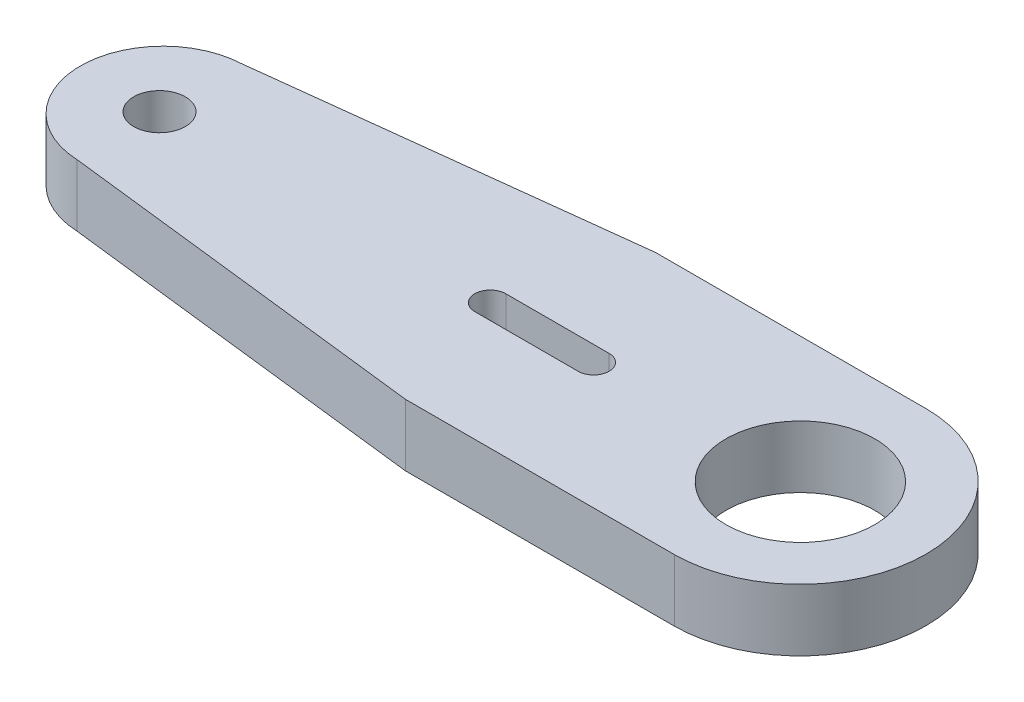
ISO-10303-21;
HEADER;
FILE_DESCRIPTION(('STEP AP214'),'2;1');
FILE_NAME('part.step','',(''),(''),'','','');
FILE_SCHEMA(('AUTOMOTIVE_DESIGN { 1 0 10303 214 1 1 1 1 }'));
ENDSEC;
DATA;
#1=APPLICATION_CONTEXT('core data for automotive mechanical design processes');
#2=APPLICATION_PROTOCOL_DEFINITION('international standard','automotive_design',2000,#1);
#3=PRODUCT_CONTEXT('',#1,'mechanical');
#4=PRODUCT('Part','Part','',(#3));
#5=PRODUCT_RELATED_PRODUCT_CATEGORY('part','',(#4));
#6=PRODUCT_DEFINITION_FORMATION('','',#4);
#7=PRODUCT_DEFINITION_CONTEXT('part definition',#1,'design');
#8=PRODUCT_DEFINITION('design','',#6,#7);
#9=PRODUCT_DEFINITION_SHAPE('','',#8);
#10=(LENGTH_UNIT() NAMED_UNIT(*) SI_UNIT(.MILLI.,.METRE.));
#11=(NAMED_UNIT(*) PLANE_ANGLE_UNIT() SI_UNIT($,.RADIAN.));
#12=(NAMED_UNIT(*) SI_UNIT($,.STERADIAN.) SOLID_ANGLE_UNIT());
#13=UNCERTAINTY_MEASURE_WITH_UNIT(LENGTH_MEASURE(1.E-05),#10,'distance_accuracy_value','');
#14=(GEOMETRIC_REPRESENTATION_CONTEXT(3) GLOBAL_UNCERTAINTY_ASSIGNED_CONTEXT((#13)) GLOBAL_UNIT_ASSIGNED_CONTEXT((#10,
#11,#12)) REPRESENTATION_CONTEXT('',''));
#15=CARTESIAN_POINT('',(0.,0.,0.));
#16=DIRECTION('',(0.,0.,1.));
#17=DIRECTION('',(1.,0.,0.));
#18=AXIS2_PLACEMENT_3D('',#15,#16,#17);
#19=CARTESIAN_POINT('',(-4.67675694278585,3.,-39.8505559009563));
#20=DIRECTION('',(0.116557468865901,0.,0.993183948949828));
#21=DIRECTION('',(0.993183948949828,0.,-0.116557468865901));
#22=AXIS2_PLACEMENT_3D('',#19,#20,#21);
#23=PLANE('',#22);
#24=DIRECTION('',(-0.993183948949828,0.,0.116557468865901));
#25=VECTOR('',#24,1.);
#26=CARTESIAN_POINT('',(-4.67675694278585,0.,-39.8505559009563));
#27=LINE('',#26,#25);
#28=CARTESIAN_POINT('',(253.819051615869,0.,-70.186947452491));
#29=VERTEX_POINT('',#28);
#30=CARTESIAN_POINT('',(235.924992032314,0.,-68.0869474524908));
#31=VERTEX_POINT('',#30);
#32=EDGE_CURVE('E169',#29,#31,#27,.T.);
#33=ORIENTED_EDGE('',*,*,#32,.T.);
#34=DIRECTION('',(0.,-1.,0.));
#35=VECTOR('',#34,1.);
#36=CARTESIAN_POINT('',(235.924992032314,3.,-68.0869474524908));
#37=LINE('',#36,#35);
#38=CARTESIAN_POINT('',(235.924992032314,3.,-68.0869474524908));
#39=VERTEX_POINT('',#38);
#40=EDGE_CURVE('E11',#39,#31,#37,.T.);
#41=ORIENTED_EDGE('',*,*,#40,.F.);
#42=DIRECTION('',(-0.993183948949828,0.,0.116557468865901));
#43=VECTOR('',#42,1.);
#44=CARTESIAN_POINT('',(-4.67675694278585,3.,-39.8505559009563));
#45=LINE('',#44,#43);
#46=CARTESIAN_POINT('',(253.819051615869,3.,-70.186947452491));
#47=VERTEX_POINT('',#46);
#48=EDGE_CURVE('E213',#47,#39,#45,.T.);
#49=ORIENTED_EDGE('',*,*,#48,.F.);
#50=DIRECTION('',(0.,-1.,0.));
#51=VECTOR('',#50,1.);
#52=CARTESIAN_POINT('',(253.819051615869,3.,-70.186947452491));
#53=LINE('',#52,#51);
#54=EDGE_CURVE('E180',#47,#29,#53,.T.);
#55=ORIENTED_EDGE('',*,*,#54,.T.);
#56=EDGE_LOOP('',(#33,#41,#49,#55));
#57=FACE_BOUND('',#56,.T.);
#58=ADVANCED_FACE('F39',(#57),#23,.F.);
#59=CARTESIAN_POINT('',(236.096696802076,3.,-64.0869474524906));
#60=DIRECTION('',(0.,-1.,0.));
#61=DIRECTION('',(0.,0.,-1.));
#62=AXIS2_PLACEMENT_3D('',#59,#60,#61);
#63=CYLINDRICAL_SURFACE('',#62,4.00368361986315);
#64=CARTESIAN_POINT('',(236.096696802076,0.,-64.0869474524906));
#65=DIRECTION('',(0.,1.,0.));
#66=DIRECTION('',(0.,0.,1.));
#67=AXIS2_PLACEMENT_3D('',#64,#65,#66);
#68=CIRCLE('',#67,4.00368361986315);
#69=CARTESIAN_POINT('',(235.924992032314,0.,-60.0869474524904));
#70=VERTEX_POINT('',#69);
#71=EDGE_CURVE('E172',#31,#70,#68,.T.);
#72=ORIENTED_EDGE('',*,*,#71,.T.);
#73=DIRECTION('',(0.,-1.,0.));
#74=VECTOR('',#73,1.);
#75=CARTESIAN_POINT('',(235.924992032314,3.,-60.0869474524904));
#76=LINE('',#75,#74);
#77=CARTESIAN_POINT('',(235.924992032314,3.,-60.0869474524904));
#78=VERTEX_POINT('',#77);
#79=EDGE_CURVE('E49',#78,#70,#76,.T.);
#80=ORIENTED_EDGE('',*,*,#79,.F.);
#81=CARTESIAN_POINT('',(236.096696802076,3.,-64.0869474524906));
#82=DIRECTION('',(0.,1.,0.));
#83=DIRECTION('',(0.,0.,1.));
#84=AXIS2_PLACEMENT_3D('',#81,#82,#83);
#85=CIRCLE('',#84,4.00368361986315);
#86=EDGE_CURVE('E220',#39,#78,#85,.T.);
#87=ORIENTED_EDGE('',*,*,#86,.F.);
#88=ORIENTED_EDGE('',*,*,#40,.T.);
#89=EDGE_LOOP('',(#72,#80,#87,#88));
#90=FACE_BOUND('',#89,.T.);
#91=ADVANCED_FACE('F225',(#90),#63,.T.);
#92=CARTESIAN_POINT('',(10.0841604415193,3.,-86.4351884860156));
#93=DIRECTION('',(0.115881324440666,0.,-0.99326306618432));
#94=DIRECTION('',(-0.99326306618432,0.,-0.115881324440666));
#95=AXIS2_PLACEMENT_3D('',#92,#93,#94);
#96=PLANE('',#95);
#97=DIRECTION('',(0.99326306618432,0.,0.115881324440666));
#98=VECTOR('',#97,1.);
#99=CARTESIAN_POINT('',(10.0841604415193,0.,-86.4351884860156));
#100=LINE('',#99,#98);
#101=CARTESIAN_POINT('',(253.924893647648,0.,-57.9869474524909));
#102=VERTEX_POINT('',#101);
#103=EDGE_CURVE('E174',#70,#102,#100,.T.);
#104=ORIENTED_EDGE('',*,*,#103,.T.);
#105=DIRECTION('',(0.,-1.,0.));
#106=VECTOR('',#105,1.);
#107=CARTESIAN_POINT('',(253.924893647648,3.,-57.9869474524909));
#108=LINE('',#107,#106);
#109=CARTESIAN_POINT('',(253.924893647648,3.,-57.9869474524909));
#110=VERTEX_POINT('',#109);
#111=EDGE_CURVE('E142',#110,#102,#108,.T.);
#112=ORIENTED_EDGE('',*,*,#111,.F.);
#113=DIRECTION('',(0.99326306618432,0.,0.115881324440666));
#114=VECTOR('',#113,1.);
#115=CARTESIAN_POINT('',(10.0841604415193,3.,-86.4351884860156));
#116=LINE('',#115,#114);
#117=EDGE_CURVE('E133',#78,#110,#116,.T.);
#118=ORIENTED_EDGE('',*,*,#117,.F.);
#119=ORIENTED_EDGE('',*,*,#79,.T.);
#120=EDGE_LOOP('',(#104,#112,#118,#119));
#121=FACE_BOUND('',#120,.T.);
#122=ADVANCED_FACE('F228',(#121),#96,.F.);
#123=CARTESIAN_POINT('',(0.,3.,-57.9869474524909));
#124=DIRECTION('',(0.,0.,-1.));
#125=DIRECTION('',(-1.,0.,0.));
#126=AXIS2_PLACEMENT_3D('',#123,#124,#125);
#127=PLANE('',#126);
#128=DIRECTION('',(1.,0.,0.));
#129=VECTOR('',#128,1.);
#130=CARTESIAN_POINT('',(0.,0.,-57.9869474524909));
#131=LINE('',#130,#129);
#132=CARTESIAN_POINT('',(266.924893647633,0.,-57.9869474524909));
#133=VERTEX_POINT('',#132);
#134=EDGE_CURVE('E141',#102,#133,#131,.T.);
#135=ORIENTED_EDGE('',*,*,#134,.T.);
#136=DIRECTION('',(0.,-1.,0.));
#137=VECTOR('',#136,1.);
#138=CARTESIAN_POINT('',(266.924893647633,3.,-57.9869474524909));
#139=LINE('',#138,#137);
#140=CARTESIAN_POINT('',(266.924893647633,3.,-57.9869474524909));
#141=VERTEX_POINT('',#140);
#142=EDGE_CURVE('E138',#141,#133,#139,.T.);
#143=ORIENTED_EDGE('',*,*,#142,.F.);
#144=DIRECTION('',(1.,0.,0.));
#145=VECTOR('',#144,1.);
#146=CARTESIAN_POINT('',(0.,3.,-57.9869474524909));
#147=LINE('',#146,#145);
#148=EDGE_CURVE('E127',#110,#141,#147,.T.);
#149=ORIENTED_EDGE('',*,*,#148,.F.);
#150=ORIENTED_EDGE('',*,*,#111,.T.);
#151=EDGE_LOOP('',(#135,#143,#149,#150));
#152=FACE_BOUND('',#151,.T.);
#153=ADVANCED_FACE('F139',(#152),#127,.F.);
#154=CARTESIAN_POINT('',(266.899778036359,3.,-64.0873224153861));
#155=DIRECTION('',(0.,-1.,0.));
#156=DIRECTION('',(0.,0.,-1.));
#157=AXIS2_PLACEMENT_3D('',#154,#155,#156);
#158=CYLINDRICAL_SURFACE('',#157,6.10042666391837);
#159=CARTESIAN_POINT('',(266.899778036359,0.,-64.0873224153861));
#160=DIRECTION('',(0.,1.,0.));
#161=DIRECTION('',(0.,0.,1.));
#162=AXIS2_PLACEMENT_3D('',#159,#160,#161);
#163=CIRCLE('',#162,6.10042666391837);
#164=CARTESIAN_POINT('',(266.940039040523,0.,-70.1876162225226));
#165=VERTEX_POINT('',#164);
#166=EDGE_CURVE('E93',#133,#165,#163,.T.);
#167=ORIENTED_EDGE('',*,*,#166,.T.);
#168=DIRECTION('',(0.,-1.,0.));
#169=VECTOR('',#168,1.);
#170=CARTESIAN_POINT('',(266.940039040523,3.,-70.1876162225226));
#171=LINE('',#170,#169);
#172=CARTESIAN_POINT('',(266.940039040523,3.,-70.1876162225226));
#173=VERTEX_POINT('',#172);
#174=EDGE_CURVE('E143',#173,#165,#171,.T.);
#175=ORIENTED_EDGE('',*,*,#174,.F.);
#176=CARTESIAN_POINT('',(266.899778036359,3.,-64.0873224153861));
#177=DIRECTION('',(0.,1.,0.));
#178=DIRECTION('',(0.,0.,1.));
#179=AXIS2_PLACEMENT_3D('',#176,#177,#178);
#180=CIRCLE('',#179,6.10042666391837);
#181=EDGE_CURVE('E131',#141,#173,#180,.T.);
#182=ORIENTED_EDGE('',*,*,#181,.F.);
#183=ORIENTED_EDGE('',*,*,#142,.T.);
#184=EDGE_LOOP('',(#167,#175,#182,#183));
#185=FACE_BOUND('',#184,.T.);
#186=ADVANCED_FACE('F145',(#185),#158,.T.);
#187=CARTESIAN_POINT('',(251.924859334147,3.,-64.086947452491));
#188=DIRECTION('',(0.,-1.,0.));
#189=DIRECTION('',(0.,0.,-1.));
#190=AXIS2_PLACEMENT_3D('',#187,#188,#189);
#191=CYLINDRICAL_SURFACE('',#190,0.749999999999991);
#192=CARTESIAN_POINT('',(251.924859334147,0.,-64.086947452491));
#193=DIRECTION('',(0.,1.,0.));
#194=DIRECTION('',(0.,0.,1.));
#195=AXIS2_PLACEMENT_3D('',#192,#193,#194);
#196=CIRCLE('',#195,0.749999999999991);
#197=CARTESIAN_POINT('',(251.9249152789,0.,-64.8369474504044));
#198=VERTEX_POINT('',#197);
#199=CARTESIAN_POINT('',(251.9249152789,0.,-63.3369474545775));
#200=VERTEX_POINT('',#199);
#201=EDGE_CURVE('E157',#198,#200,#196,.T.);
#202=ORIENTED_EDGE('',*,*,#201,.F.);
#203=DIRECTION('',(0.,-1.,0.));
#204=VECTOR('',#203,1.);
#205=CARTESIAN_POINT('',(251.9249152789,3.,-64.8369474504044));
#206=LINE('',#205,#204);
#207=CARTESIAN_POINT('',(251.9249152789,3.,-64.8369474504044));
#208=VERTEX_POINT('',#207);
#209=EDGE_CURVE('E43',#208,#198,#206,.T.);
#210=ORIENTED_EDGE('',*,*,#209,.F.);
#211=CARTESIAN_POINT('',(251.924859334147,3.,-64.086947452491));
#212=DIRECTION('',(0.,1.,0.));
#213=DIRECTION('',(0.,0.,1.));
#214=AXIS2_PLACEMENT_3D('',#211,#212,#213);
#215=CIRCLE('',#214,0.749999999999991);
#216=CARTESIAN_POINT('',(251.9249152789,3.,-63.3369474545775));
#217=VERTEX_POINT('',#216);
#218=EDGE_CURVE('E204',#208,#217,#215,.T.);
#219=ORIENTED_EDGE('',*,*,#218,.T.);
#220=DIRECTION('',(0.,-1.,0.));
#221=VECTOR('',#220,1.);
#222=CARTESIAN_POINT('',(251.9249152789,3.,-63.3369474545775));
#223=LINE('',#222,#221);
#224=EDGE_CURVE('E147',#217,#200,#223,.T.);
#225=ORIENTED_EDGE('',*,*,#224,.T.);
#226=EDGE_LOOP('',(#202,#210,#219,#225));
#227=FACE_BOUND('',#226,.T.);
#228=ADVANCED_FACE('F202',(#227),#191,.F.);
#229=CARTESIAN_POINT('',(2.15767132296885E-08,3.,-64.8369475342411));
#230=DIRECTION('',(3.32784223351873E-10,0.,-1.));
#231=DIRECTION('',(-1.,0.,-3.32784223351873E-10));
#232=AXIS2_PLACEMENT_3D('',#229,#230,#231);
#233=PLANE('',#232);
#234=DIRECTION('',(1.,0.,3.32784223351873E-10));
#235=VECTOR('',#234,1.);
#236=CARTESIAN_POINT('',(2.15767132296885E-08,0.,-64.8369475342411));
#237=LINE('',#236,#235);
#238=CARTESIAN_POINT('',(256.9249089259,0.,-64.8369474487405));
#239=VERTEX_POINT('',#238);
#240=EDGE_CURVE('E160',#198,#239,#237,.T.);
#241=ORIENTED_EDGE('',*,*,#240,.T.);
#242=DIRECTION('',(0.,-1.,0.));
#243=VECTOR('',#242,1.);
#244=CARTESIAN_POINT('',(256.9249089259,3.,-64.8369474487405));
#245=LINE('',#244,#243);
#246=CARTESIAN_POINT('',(256.9249089259,3.,-64.8369474487405));
#247=VERTEX_POINT('',#246);
#248=EDGE_CURVE('E188',#247,#239,#245,.T.);
#249=ORIENTED_EDGE('',*,*,#248,.F.);
#250=DIRECTION('',(1.,0.,3.32784223351873E-10));
#251=VECTOR('',#250,1.);
#252=CARTESIAN_POINT('',(2.15767132296885E-08,3.,-64.8369475342411));
#253=LINE('',#252,#251);
#254=EDGE_CURVE('E196',#208,#247,#253,.T.);
#255=ORIENTED_EDGE('',*,*,#254,.F.);
#256=ORIENTED_EDGE('',*,*,#209,.T.);
#257=EDGE_LOOP('',(#241,#249,#255,#256));
#258=FACE_BOUND('',#257,.T.);
#259=ADVANCED_FACE('F195',(#258),#233,.F.);
#260=CARTESIAN_POINT('',(256.924833922149,3.,-64.0869474524909));
#261=DIRECTION('',(0.,-1.,0.));
#262=DIRECTION('',(0.,0.,-1.));
#263=AXIS2_PLACEMENT_3D('',#260,#261,#262);
#264=CYLINDRICAL_SURFACE('',#263,0.749999999999959);
#265=CARTESIAN_POINT('',(256.924833922149,0.,-64.0869474524909));
#266=DIRECTION('',(0.,1.,0.));
#267=DIRECTION('',(0.,0.,1.));
#268=AXIS2_PLACEMENT_3D('',#265,#266,#267);
#269=CIRCLE('',#268,0.749999999999959);
#270=CARTESIAN_POINT('',(256.9249089259,0.,-63.3369474562414));
#271=VERTEX_POINT('',#270);
#272=EDGE_CURVE('E163',#271,#239,#269,.T.);
#273=ORIENTED_EDGE('',*,*,#272,.F.);
#274=DIRECTION('',(0.,-1.,0.));
#275=VECTOR('',#274,1.);
#276=CARTESIAN_POINT('',(256.9249089259,3.,-63.3369474562414));
#277=LINE('',#276,#275);
#278=CARTESIAN_POINT('',(256.9249089259,3.,-63.3369474562414));
#279=VERTEX_POINT('',#278);
#280=EDGE_CURVE('E187',#279,#271,#277,.T.);
#281=ORIENTED_EDGE('',*,*,#280,.F.);
#282=CARTESIAN_POINT('',(256.924833922149,3.,-64.0869474524909));
#283=DIRECTION('',(0.,1.,0.));
#284=DIRECTION('',(0.,0.,1.));
#285=AXIS2_PLACEMENT_3D('',#282,#283,#284);
#286=CIRCLE('',#285,0.749999999999959);
#287=EDGE_CURVE('E210',#279,#247,#286,.T.);
#288=ORIENTED_EDGE('',*,*,#287,.T.);
#289=ORIENTED_EDGE('',*,*,#248,.T.);
#290=EDGE_LOOP('',(#273,#281,#288,#289));
#291=FACE_BOUND('',#290,.T.);
#292=ADVANCED_FACE('F208',(#291),#264,.F.);
#293=CARTESIAN_POINT('',(-2.10761304757217E-08,3.,-63.3369473707465));
#294=DIRECTION('',(3.32762018863197E-10,0.,1.));
#295=DIRECTION('',(1.,0.,-3.32762018863197E-10));
#296=AXIS2_PLACEMENT_3D('',#293,#294,#295);
#297=PLANE('',#296);
#298=DIRECTION('',(-1.,0.,3.32762018863197E-10));
#299=VECTOR('',#298,1.);
#300=CARTESIAN_POINT('',(-2.10761304757217E-08,0.,-63.3369473707465));
#301=LINE('',#300,#299);
#302=EDGE_CURVE('E166',#271,#200,#301,.T.);
#303=ORIENTED_EDGE('',*,*,#302,.T.);
#304=ORIENTED_EDGE('',*,*,#224,.F.);
#305=DIRECTION('',(-1.,0.,3.32762018863197E-10));
#306=VECTOR('',#305,1.);
#307=CARTESIAN_POINT('',(-2.10761304757217E-08,3.,-63.3369473707465));
#308=LINE('',#307,#306);
#309=EDGE_CURVE('E211',#279,#217,#308,.T.);
#310=ORIENTED_EDGE('',*,*,#309,.F.);
#311=ORIENTED_EDGE('',*,*,#280,.T.);
#312=EDGE_LOOP('',(#303,#304,#310,#311));
#313=FACE_BOUND('',#312,.T.);
#314=ADVANCED_FACE('F207',(#313),#297,.F.);
#315=CARTESIAN_POINT('',(266.924883927151,3.,-64.0869974524909));
#316=DIRECTION('',(0.,-1.,0.));
#317=DIRECTION('',(0.,0.,-1.));
#318=AXIS2_PLACEMENT_3D('',#315,#316,#317);
#319=CYLINDRICAL_SURFACE('',#318,3.60000000000001);
#320=CARTESIAN_POINT('',(266.924883927151,3.,-64.0869974524909));
#321=DIRECTION('',(0.,1.,0.));
#322=DIRECTION('',(0.,0.,1.));
#323=AXIS2_PLACEMENT_3D('',#320,#321,#322);
#324=CIRCLE('',#323,3.60000000000001);
#325=CARTESIAN_POINT('',(266.924883927151,3.,-60.4869974524909));
#326=VERTEX_POINT('',#325);
#327=EDGE_CURVE('E266',#326,#326,#324,.T.);
#328=ORIENTED_EDGE('',*,*,#327,.T.);
#329=EDGE_LOOP('',(#328));
#330=FACE_BOUND('',#329,.T.);
#331=CARTESIAN_POINT('',(266.924883927151,0.,-64.0869974524909));
#332=DIRECTION('',(0.,1.,0.));
#333=DIRECTION('',(0.,0.,1.));
#334=AXIS2_PLACEMENT_3D('',#331,#332,#333);
#335=CIRCLE('',#334,3.60000000000001);
#336=CARTESIAN_POINT('',(266.924883927151,0.,-60.4869974524909));
#337=VERTEX_POINT('',#336);
#338=EDGE_CURVE('E154',#337,#337,#335,.T.);
#339=ORIENTED_EDGE('',*,*,#338,.F.);
#340=EDGE_LOOP('',(#339));
#341=FACE_BOUND('',#340,.T.);
#342=ADVANCED_FACE('F240',(#330,#341),#319,.F.);
#343=CARTESIAN_POINT('',(235.924992032314,3.,-64.0869474524909));
#344=DIRECTION('',(0.,-1.,0.));
#345=DIRECTION('',(0.,0.,-1.));
#346=AXIS2_PLACEMENT_3D('',#343,#344,#345);
#347=CYLINDRICAL_SURFACE('',#346,1.25000000000001);
#348=CARTESIAN_POINT('',(235.924992032314,3.,-64.0869474524909));
#349=DIRECTION('',(0.,1.,0.));
#350=DIRECTION('',(0.,0.,1.));
#351=AXIS2_PLACEMENT_3D('',#348,#349,#350);
#352=CIRCLE('',#351,1.25000000000001);
#353=CARTESIAN_POINT('',(235.924992032314,3.,-62.8369474524909));
#354=VERTEX_POINT('',#353);
#355=EDGE_CURVE('E179',#354,#354,#352,.T.);
#356=ORIENTED_EDGE('',*,*,#355,.T.);
#357=EDGE_LOOP('',(#356));
#358=FACE_BOUND('',#357,.T.);
#359=CARTESIAN_POINT('',(235.924992032314,0.,-64.0869474524909));
#360=DIRECTION('',(0.,1.,0.));
#361=DIRECTION('',(0.,0.,1.));
#362=AXIS2_PLACEMENT_3D('',#359,#360,#361);
#363=CIRCLE('',#362,1.25000000000001);
#364=CARTESIAN_POINT('',(235.924992032314,0.,-62.8369474524909));
#365=VERTEX_POINT('',#364);
#366=EDGE_CURVE('E151',#365,#365,#363,.T.);
#367=ORIENTED_EDGE('',*,*,#366,.F.);
#368=EDGE_LOOP('',(#367));
#369=FACE_BOUND('',#368,.T.);
#370=ADVANCED_FACE('F41',(#358,#369),#347,.F.);
#371=CARTESIAN_POINT('',(-0.00357673348291355,3.,-70.1740102426835));
#372=DIRECTION('',(5.09694895004306E-05,0.,0.999999998701055));
#373=DIRECTION('',(0.999999998701056,0.,-5.09694895004307E-05));
#374=AXIS2_PLACEMENT_3D('',#371,#372,#373);
#375=PLANE('',#374);
#376=DIRECTION('',(-0.999999998701056,0.,5.09694895004306E-05));
#377=VECTOR('',#376,1.);
#378=CARTESIAN_POINT('',(-0.00357673348291355,0.,-70.1740102426835));
#379=LINE('',#378,#377);
#380=EDGE_CURVE('E99',#165,#29,#379,.T.);
#381=ORIENTED_EDGE('',*,*,#380,.T.);
#382=ORIENTED_EDGE('',*,*,#54,.F.);
#383=DIRECTION('',(-0.999999998701056,0.,5.09694895004306E-05));
#384=VECTOR('',#383,1.);
#385=CARTESIAN_POINT('',(-0.00357673348291355,3.,-70.1740102426835));
#386=LINE('',#385,#384);
#387=EDGE_CURVE('E58',#173,#47,#386,.T.);
#388=ORIENTED_EDGE('',*,*,#387,.F.);
#389=ORIENTED_EDGE('',*,*,#174,.T.);
#390=EDGE_LOOP('',(#381,#382,#388,#389));
#391=FACE_BOUND('',#390,.T.);
#392=ADVANCED_FACE('F231',(#391),#375,.F.);
#393=CARTESIAN_POINT('',(0.,3.,0.));
#394=DIRECTION('',(0.,1.,0.));
#395=DIRECTION('',(0.,0.,1.));
#396=AXIS2_PLACEMENT_3D('',#393,#394,#395);
#397=PLANE('',#396);
#398=ORIENTED_EDGE('',*,*,#355,.F.);
#399=EDGE_LOOP('',(#398));
#400=FACE_BOUND('',#399,.T.);
#401=ORIENTED_EDGE('',*,*,#327,.F.);
#402=EDGE_LOOP('',(#401));
#403=FACE_BOUND('',#402,.T.);
#404=ORIENTED_EDGE('',*,*,#218,.F.);
#405=ORIENTED_EDGE('',*,*,#254,.T.);
#406=ORIENTED_EDGE('',*,*,#287,.F.);
#407=ORIENTED_EDGE('',*,*,#309,.T.);
#408=EDGE_LOOP('',(#404,#405,#406,#407));
#409=FACE_BOUND('',#408,.T.);
#410=ORIENTED_EDGE('',*,*,#48,.T.);
#411=ORIENTED_EDGE('',*,*,#86,.T.);
#412=ORIENTED_EDGE('',*,*,#117,.T.);
#413=ORIENTED_EDGE('',*,*,#148,.T.);
#414=ORIENTED_EDGE('',*,*,#181,.T.);
#415=ORIENTED_EDGE('',*,*,#387,.T.);
#416=EDGE_LOOP('',(#410,#411,#412,#413,#414,#415));
#417=FACE_BOUND('',#416,.T.);
#418=ADVANCED_FACE('F129',(#400,#403,#409,#417),#397,.T.);
#419=CARTESIAN_POINT('',(0.,0.,0.));
#420=DIRECTION('',(0.,1.,0.));
#421=DIRECTION('',(0.,0.,1.));
#422=AXIS2_PLACEMENT_3D('',#419,#420,#421);
#423=PLANE('',#422);
#424=ORIENTED_EDGE('',*,*,#366,.T.);
#425=EDGE_LOOP('',(#424));
#426=FACE_BOUND('',#425,.T.);
#427=ORIENTED_EDGE('',*,*,#338,.T.);
#428=EDGE_LOOP('',(#427));
#429=FACE_BOUND('',#428,.T.);
#430=ORIENTED_EDGE('',*,*,#201,.T.);
#431=ORIENTED_EDGE('',*,*,#302,.F.);
#432=ORIENTED_EDGE('',*,*,#272,.T.);
#433=ORIENTED_EDGE('',*,*,#240,.F.);
#434=EDGE_LOOP('',(#430,#431,#432,#433));
#435=FACE_BOUND('',#434,.T.);
#436=ORIENTED_EDGE('',*,*,#32,.F.);
#437=ORIENTED_EDGE('',*,*,#380,.F.);
#438=ORIENTED_EDGE('',*,*,#166,.F.);
#439=ORIENTED_EDGE('',*,*,#134,.F.);
#440=ORIENTED_EDGE('',*,*,#103,.F.);
#441=ORIENTED_EDGE('',*,*,#71,.F.);
#442=EDGE_LOOP('',(#436,#437,#438,#439,#440,#441));
#443=FACE_BOUND('',#442,.T.);
#444=ADVANCED_FACE('F199',(#426,#429,#435,#443),#423,.F.);
#445=CLOSED_SHELL('',(#58,#91,#122,#153,#186,#228,#259,#292,#314,#342,#370,#392,#418,#444));
#446=MANIFOLD_SOLID_BREP('B2',#445);
#447=ADVANCED_BREP_SHAPE_REPRESENTATION('',(#18,#446),#14);
#448=SHAPE_DEFINITION_REPRESENTATION(#9,#447);
ENDSEC;
END-ISO-10303-21;
